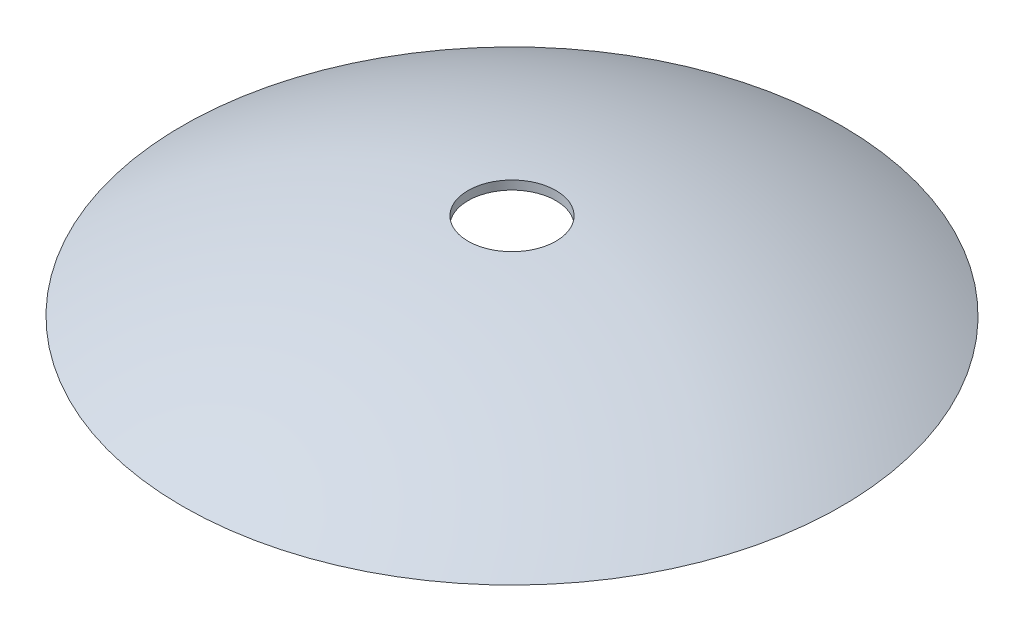
ISO-10303-21;
HEADER;
FILE_DESCRIPTION(('STEP AP214'),'2;1');
FILE_NAME('part.step','',(''),(''),'','','');
FILE_SCHEMA(('AUTOMOTIVE_DESIGN { 1 0 10303 214 1 1 1 1 }'));
ENDSEC;
DATA;
#1=APPLICATION_CONTEXT('core data for automotive mechanical design processes');
#2=APPLICATION_PROTOCOL_DEFINITION('international standard','automotive_design',2000,#1);
#3=PRODUCT_CONTEXT('',#1,'mechanical');
#4=PRODUCT('Part','Part','',(#3));
#5=PRODUCT_RELATED_PRODUCT_CATEGORY('part','',(#4));
#6=PRODUCT_DEFINITION_FORMATION('','',#4);
#7=PRODUCT_DEFINITION_CONTEXT('part definition',#1,'design');
#8=PRODUCT_DEFINITION('design','',#6,#7);
#9=PRODUCT_DEFINITION_SHAPE('','',#8);
#10=(LENGTH_UNIT() NAMED_UNIT(*) SI_UNIT(.MILLI.,.METRE.));
#11=(NAMED_UNIT(*) PLANE_ANGLE_UNIT() SI_UNIT($,.RADIAN.));
#12=(NAMED_UNIT(*) SI_UNIT($,.STERADIAN.) SOLID_ANGLE_UNIT());
#13=UNCERTAINTY_MEASURE_WITH_UNIT(LENGTH_MEASURE(1.E-05),#10,'distance_accuracy_value','');
#14=(GEOMETRIC_REPRESENTATION_CONTEXT(3) GLOBAL_UNCERTAINTY_ASSIGNED_CONTEXT((#13)) GLOBAL_UNIT_ASSIGNED_CONTEXT((#10,
#11,#12)) REPRESENTATION_CONTEXT('',''));
#15=CARTESIAN_POINT('',(0.,0.,0.));
#16=DIRECTION('',(0.,0.,1.));
#17=DIRECTION('',(1.,0.,0.));
#18=AXIS2_PLACEMENT_3D('',#15,#16,#17);
#19=CARTESIAN_POINT('',(0.,-125.885549788238,0.));
#20=DIRECTION('',(0.,1.,0.));
#21=DIRECTION('',(0.,0.,1.));
#22=AXIS2_PLACEMENT_3D('',#19,#20,#21);
#23=DEGENERATE_TOROIDAL_SURFACE('',#22,1.26385338980307,145.891024269513,.T.);
#24=CARTESIAN_POINT('',(0.,0.,0.));
#25=DIRECTION('',(0.,1.,0.));
#26=DIRECTION('',(0.,0.,1.));
#27=AXIS2_PLACEMENT_3D('',#24,#25,#26);
#28=CIRCLE('',#27,75.);
#29=CARTESIAN_POINT('',(0.,0.,75.));
#30=VERTEX_POINT('',#29);
#31=EDGE_CURVE('E10',#30,#30,#28,.T.);
#32=ORIENTED_EDGE('',*,*,#31,.T.);
#33=EDGE_LOOP('',(#32));
#34=FACE_BOUND('',#33,.T.);
#35=CARTESIAN_POINT('',(0.,19.7436736005191,0.));
#36=DIRECTION('',(0.,-1.,0.));
#37=DIRECTION('',(0.,0.,-1.));
#38=AXIS2_PLACEMENT_3D('',#35,#36,#37);
#39=CIRCLE('',#38,10.);
#40=CARTESIAN_POINT('',(0.,19.7436736005191,-10.));
#41=VERTEX_POINT('',#40);
#42=EDGE_CURVE('E57',#41,#41,#39,.F.);
#43=ORIENTED_EDGE('',*,*,#42,.F.);
#44=EDGE_LOOP('',(#43));
#45=FACE_BOUND('',#44,.T.);
#46=ADVANCED_FACE('F44',(#34,#45),#23,.T.);
#47=CARTESIAN_POINT('',(0.,-125.885549788238,0.));
#48=DIRECTION('',(0.,1.,0.));
#49=DIRECTION('',(0.,0.,1.));
#50=AXIS2_PLACEMENT_3D('',#47,#48,#49);
#51=DEGENERATE_TOROIDAL_SURFACE('',#50,1.26385338980307,143.891024269513,.T.);
#52=CARTESIAN_POINT('',(0.,0.,0.));
#53=DIRECTION('',(0.,1.,0.));
#54=DIRECTION('',(0.,0.,1.));
#55=AXIS2_PLACEMENT_3D('',#52,#53,#54);
#56=CIRCLE('',#55,70.9592995813757);
#57=CARTESIAN_POINT('',(0.,0.,70.9592995813757));
#58=VERTEX_POINT('',#57);
#59=EDGE_CURVE('E52',#58,#58,#56,.T.);
#60=ORIENTED_EDGE('',*,*,#59,.F.);
#61=EDGE_LOOP('',(#60));
#62=FACE_BOUND('',#61,.T.);
#63=CARTESIAN_POINT('',(0.,17.7400280443141,0.));
#64=DIRECTION('',(0.,-1.,0.));
#65=DIRECTION('',(0.,0.,-1.));
#66=AXIS2_PLACEMENT_3D('',#63,#64,#65);
#67=CIRCLE('',#66,10.);
#68=CARTESIAN_POINT('',(0.,17.7400280443141,-10.));
#69=VERTEX_POINT('',#68);
#70=EDGE_CURVE('E47',#69,#69,#67,.F.);
#71=ORIENTED_EDGE('',*,*,#70,.T.);
#72=EDGE_LOOP('',(#71));
#73=FACE_BOUND('',#72,.T.);
#74=ADVANCED_FACE('F68',(#62,#73),#51,.F.);
#75=CARTESIAN_POINT('',(0.,0.,0.));
#76=DIRECTION('',(0.,1.,0.));
#77=DIRECTION('',(0.,0.,1.));
#78=AXIS2_PLACEMENT_3D('',#75,#76,#77);
#79=PLANE('',#78);
#80=ORIENTED_EDGE('',*,*,#59,.T.);
#81=EDGE_LOOP('',(#80));
#82=FACE_BOUND('',#81,.T.);
#83=ORIENTED_EDGE('',*,*,#31,.F.);
#84=EDGE_LOOP('',(#83));
#85=FACE_BOUND('',#84,.T.);
#86=ADVANCED_FACE('F72',(#82,#85),#79,.F.);
#87=CARTESIAN_POINT('',(0.,22.,0.));
#88=DIRECTION('',(0.,-1.,0.));
#89=DIRECTION('',(0.,0.,-1.));
#90=AXIS2_PLACEMENT_3D('',#87,#88,#89);
#91=CYLINDRICAL_SURFACE('',#90,10.);
#92=ORIENTED_EDGE('',*,*,#70,.F.);
#93=EDGE_LOOP('',(#92));
#94=FACE_BOUND('',#93,.T.);
#95=ORIENTED_EDGE('',*,*,#42,.T.);
#96=EDGE_LOOP('',(#95));
#97=FACE_BOUND('',#96,.T.);
#98=ADVANCED_FACE('F70',(#94,#97),#91,.F.);
#99=CLOSED_SHELL('',(#46,#74,#86,#98));
#100=MANIFOLD_SOLID_BREP('B2',#99);
#101=ADVANCED_BREP_SHAPE_REPRESENTATION('',(#18,#100),#14);
#102=SHAPE_DEFINITION_REPRESENTATION(#9,#101);
ENDSEC;
END-ISO-10303-21;
